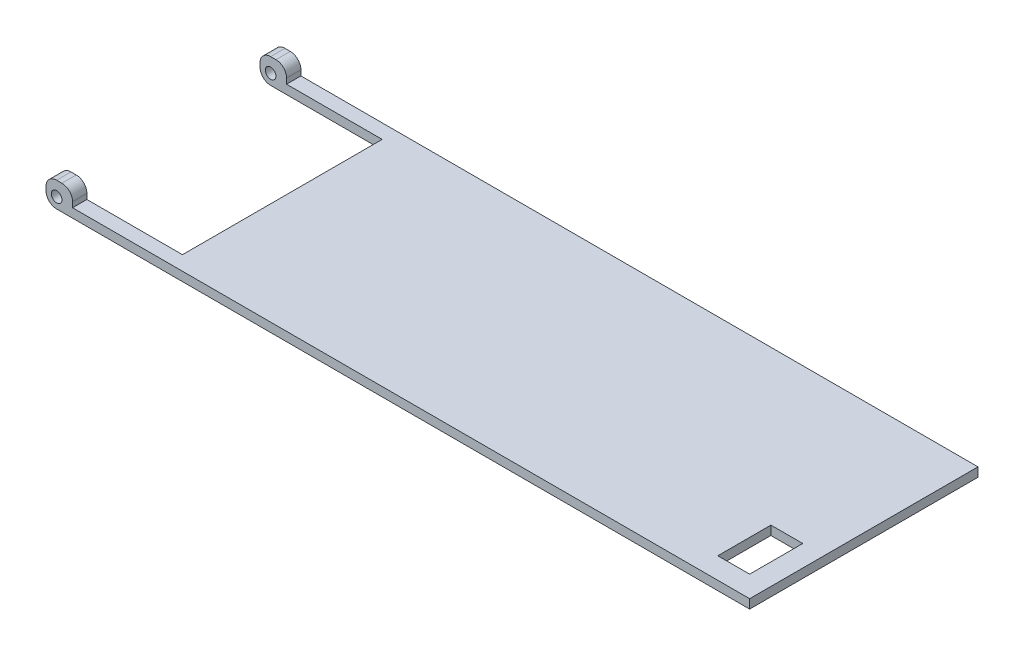
ISO-10303-21;
HEADER;
FILE_DESCRIPTION(('STEP AP214'),'2;1');
FILE_NAME('part.step','',(''),(''),'','','');
FILE_SCHEMA(('AUTOMOTIVE_DESIGN { 1 0 10303 214 1 1 1 1 }'));
ENDSEC;
DATA;
#1=APPLICATION_CONTEXT('core data for automotive mechanical design processes');
#2=APPLICATION_PROTOCOL_DEFINITION('international standard','automotive_design',2000,#1);
#3=PRODUCT_CONTEXT('',#1,'mechanical');
#4=PRODUCT('Part','Part','',(#3));
#5=PRODUCT_RELATED_PRODUCT_CATEGORY('part','',(#4));
#6=PRODUCT_DEFINITION_FORMATION('','',#4);
#7=PRODUCT_DEFINITION_CONTEXT('part definition',#1,'design');
#8=PRODUCT_DEFINITION('design','',#6,#7);
#9=PRODUCT_DEFINITION_SHAPE('','',#8);
#10=(LENGTH_UNIT() NAMED_UNIT(*) SI_UNIT(.MILLI.,.METRE.));
#11=(NAMED_UNIT(*) PLANE_ANGLE_UNIT() SI_UNIT($,.RADIAN.));
#12=(NAMED_UNIT(*) SI_UNIT($,.STERADIAN.) SOLID_ANGLE_UNIT());
#13=UNCERTAINTY_MEASURE_WITH_UNIT(LENGTH_MEASURE(1.E-05),#10,'distance_accuracy_value','');
#14=(GEOMETRIC_REPRESENTATION_CONTEXT(3) GLOBAL_UNCERTAINTY_ASSIGNED_CONTEXT((#13)) GLOBAL_UNIT_ASSIGNED_CONTEXT((#10,
#11,#12)) REPRESENTATION_CONTEXT('',''));
#15=CARTESIAN_POINT('',(0.,0.,0.));
#16=DIRECTION('',(0.,0.,1.));
#17=DIRECTION('',(1.,0.,0.));
#18=AXIS2_PLACEMENT_3D('',#15,#16,#17);
#19=CARTESIAN_POINT('',(0.,1.7,0.));
#20=DIRECTION('',(0.,-1.,0.));
#21=DIRECTION('',(0.,0.,-1.));
#22=AXIS2_PLACEMENT_3D('',#19,#20,#21);
#23=PLANE('',#22);
#24=DIRECTION('',(-1.,0.,0.));
#25=VECTOR('',#24,1.);
#26=CARTESIAN_POINT('',(56.25,1.7,7.5));
#27=LINE('',#26,#25);
#28=CARTESIAN_POINT('',(62.25,1.7,7.5));
#29=VERTEX_POINT('',#28);
#30=CARTESIAN_POINT('',(56.25,1.7,7.5));
#31=VERTEX_POINT('',#30);
#32=EDGE_CURVE('E228',#29,#31,#27,.T.);
#33=ORIENTED_EDGE('',*,*,#32,.F.);
#34=DIRECTION('',(0.,0.,-1.));
#35=VECTOR('',#34,1.);
#36=CARTESIAN_POINT('',(62.25,1.7,17.5));
#37=LINE('',#36,#35);
#38=CARTESIAN_POINT('',(62.25,1.7,17.5));
#39=VERTEX_POINT('',#38);
#40=EDGE_CURVE('E61',#39,#29,#37,.T.);
#41=ORIENTED_EDGE('',*,*,#40,.F.);
#42=DIRECTION('',(1.,0.,0.));
#43=VECTOR('',#42,1.);
#44=CARTESIAN_POINT('',(56.25,1.7,17.5));
#45=LINE('',#44,#43);
#46=CARTESIAN_POINT('',(56.25,1.7,17.5));
#47=VERTEX_POINT('',#46);
#48=EDGE_CURVE('E215',#47,#39,#45,.T.);
#49=ORIENTED_EDGE('',*,*,#48,.F.);
#50=DIRECTION('',(0.,0.,1.));
#51=VECTOR('',#50,1.);
#52=CARTESIAN_POINT('',(56.25,1.7,17.5));
#53=LINE('',#52,#51);
#54=EDGE_CURVE('E219',#31,#47,#53,.T.);
#55=ORIENTED_EDGE('',*,*,#54,.F.);
#56=EDGE_LOOP('',(#33,#41,#49,#55));
#57=FACE_BOUND('',#56,.T.);
#58=DIRECTION('',(-1.,0.,0.));
#59=VECTOR('',#58,1.);
#60=CARTESIAN_POINT('',(-66.25,1.7,-21.5));
#61=LINE('',#60,#59);
#62=CARTESIAN_POINT('',(66.25,1.7,-21.5));
#63=VERTEX_POINT('',#62);
#64=CARTESIAN_POINT('',(-61.25,1.7,-21.5));
#65=VERTEX_POINT('',#64);
#66=EDGE_CURVE('E336',#63,#65,#61,.T.);
#67=ORIENTED_EDGE('',*,*,#66,.T.);
#68=DIRECTION('',(0.,0.,1.));
#69=VECTOR('',#68,1.);
#70=CARTESIAN_POINT('',(-61.25,1.7,-18.8));
#71=LINE('',#70,#69);
#72=CARTESIAN_POINT('',(-61.25,1.7,-18.8));
#73=VERTEX_POINT('',#72);
#74=EDGE_CURVE('E247',#65,#73,#71,.T.);
#75=ORIENTED_EDGE('',*,*,#74,.T.);
#76=DIRECTION('',(-1.,0.,0.));
#77=VECTOR('',#76,1.);
#78=CARTESIAN_POINT('',(-66.25,1.7,-18.8));
#79=LINE('',#78,#77);
#80=CARTESIAN_POINT('',(-43.25,1.7,-18.8));
#81=VERTEX_POINT('',#80);
#82=EDGE_CURVE('E299',#81,#73,#79,.T.);
#83=ORIENTED_EDGE('',*,*,#82,.F.);
#84=DIRECTION('',(0.,0.,-1.));
#85=VECTOR('',#84,1.);
#86=CARTESIAN_POINT('',(-43.25,1.7,18.8));
#87=LINE('',#86,#85);
#88=CARTESIAN_POINT('',(-43.25,1.7,18.8));
#89=VERTEX_POINT('',#88);
#90=EDGE_CURVE('E310',#89,#81,#87,.T.);
#91=ORIENTED_EDGE('',*,*,#90,.F.);
#92=DIRECTION('',(1.,0.,0.));
#93=VECTOR('',#92,1.);
#94=CARTESIAN_POINT('',(-66.25,1.7,18.8));
#95=LINE('',#94,#93);
#96=CARTESIAN_POINT('',(-61.25,1.7,18.8));
#97=VERTEX_POINT('',#96);
#98=EDGE_CURVE('E294',#97,#89,#95,.T.);
#99=ORIENTED_EDGE('',*,*,#98,.F.);
#100=DIRECTION('',(0.,0.,-1.));
#101=VECTOR('',#100,1.);
#102=CARTESIAN_POINT('',(-61.25,1.7,18.8));
#103=LINE('',#102,#101);
#104=CARTESIAN_POINT('',(-61.25,1.7,21.5));
#105=VERTEX_POINT('',#104);
#106=EDGE_CURVE('E273',#105,#97,#103,.T.);
#107=ORIENTED_EDGE('',*,*,#106,.F.);
#108=DIRECTION('',(1.,0.,0.));
#109=VECTOR('',#108,1.);
#110=CARTESIAN_POINT('',(-66.25,1.7,21.5));
#111=LINE('',#110,#109);
#112=CARTESIAN_POINT('',(66.25,1.7,21.5));
#113=VERTEX_POINT('',#112);
#114=EDGE_CURVE('E341',#105,#113,#111,.T.);
#115=ORIENTED_EDGE('',*,*,#114,.T.);
#116=DIRECTION('',(0.,0.,-1.));
#117=VECTOR('',#116,1.);
#118=CARTESIAN_POINT('',(66.25,1.7,21.5));
#119=LINE('',#118,#117);
#120=EDGE_CURVE('E332',#113,#63,#119,.T.);
#121=ORIENTED_EDGE('',*,*,#120,.T.);
#122=EDGE_LOOP('',(#67,#75,#83,#91,#99,#107,#115,#121));
#123=FACE_BOUND('',#122,.T.);
#124=ADVANCED_FACE('F45',(#57,#123),#23,.F.);
#125=CARTESIAN_POINT('',(-66.25,1.7,21.5));
#126=DIRECTION('',(1.,0.,0.));
#127=DIRECTION('',(0.,0.,-1.));
#128=AXIS2_PLACEMENT_3D('',#125,#126,#127);
#129=PLANE('',#128);
#130=DIRECTION('',(0.,-1.,0.));
#131=VECTOR('',#130,1.);
#132=CARTESIAN_POINT('',(-66.25,1.7,-21.5));
#133=LINE('',#132,#131);
#134=CARTESIAN_POINT('',(-66.25,2.7,-21.5));
#135=VERTEX_POINT('',#134);
#136=CARTESIAN_POINT('',(-66.25,2.,-21.5));
#137=VERTEX_POINT('',#136);
#138=EDGE_CURVE('E361',#135,#137,#133,.T.);
#139=ORIENTED_EDGE('',*,*,#138,.T.);
#140=DIRECTION('',(0.,0.,1.));
#141=VECTOR('',#140,1.);
#142=CARTESIAN_POINT('',(-66.25,2.,-18.8));
#143=LINE('',#142,#141);
#144=CARTESIAN_POINT('',(-66.25,2.,-18.8));
#145=VERTEX_POINT('',#144);
#146=EDGE_CURVE('E412',#137,#145,#143,.T.);
#147=ORIENTED_EDGE('',*,*,#146,.T.);
#148=DIRECTION('',(0.,1.,0.));
#149=VECTOR('',#148,1.);
#150=CARTESIAN_POINT('',(-66.25,0.,-18.8));
#151=LINE('',#150,#149);
#152=CARTESIAN_POINT('',(-66.25,2.7,-18.8));
#153=VERTEX_POINT('',#152);
#154=EDGE_CURVE('E317',#145,#153,#151,.T.);
#155=ORIENTED_EDGE('',*,*,#154,.T.);
#156=DIRECTION('',(0.,0.,-1.));
#157=VECTOR('',#156,1.);
#158=CARTESIAN_POINT('',(-66.25,2.7,-21.5));
#159=LINE('',#158,#157);
#160=EDGE_CURVE('E408',#153,#135,#159,.T.);
#161=ORIENTED_EDGE('',*,*,#160,.T.);
#162=EDGE_LOOP('',(#139,#147,#155,#161));
#163=FACE_BOUND('',#162,.T.);
#164=ADVANCED_FACE('F456',(#163),#129,.F.);
#165=CARTESIAN_POINT('',(66.25,1.7,21.5));
#166=DIRECTION('',(-1.,0.,0.));
#167=DIRECTION('',(0.,0.,1.));
#168=AXIS2_PLACEMENT_3D('',#165,#166,#167);
#169=PLANE('',#168);
#170=DIRECTION('',(0.,0.,-1.));
#171=VECTOR('',#170,1.);
#172=CARTESIAN_POINT('',(66.25,0.,21.5));
#173=LINE('',#172,#171);
#174=CARTESIAN_POINT('',(66.25,0.,21.5));
#175=VERTEX_POINT('',#174);
#176=CARTESIAN_POINT('',(66.25,0.,-21.5));
#177=VERTEX_POINT('',#176);
#178=EDGE_CURVE('E321',#175,#177,#173,.T.);
#179=ORIENTED_EDGE('',*,*,#178,.T.);
#180=DIRECTION('',(0.,-1.,0.));
#181=VECTOR('',#180,1.);
#182=CARTESIAN_POINT('',(66.25,1.7,-21.5));
#183=LINE('',#182,#181);
#184=EDGE_CURVE('E365',#63,#177,#183,.T.);
#185=ORIENTED_EDGE('',*,*,#184,.F.);
#186=ORIENTED_EDGE('',*,*,#120,.F.);
#187=DIRECTION('',(0.,-1.,0.));
#188=VECTOR('',#187,1.);
#189=CARTESIAN_POINT('',(66.25,1.7,21.5));
#190=LINE('',#189,#188);
#191=EDGE_CURVE('E344',#113,#175,#190,.T.);
#192=ORIENTED_EDGE('',*,*,#191,.T.);
#193=EDGE_LOOP('',(#179,#185,#186,#192));
#194=FACE_BOUND('',#193,.T.);
#195=ADVANCED_FACE('F512',(#194),#169,.F.);
#196=CARTESIAN_POINT('',(-66.25,1.7,-21.5));
#197=DIRECTION('',(0.,0.,1.));
#198=DIRECTION('',(1.,0.,0.));
#199=AXIS2_PLACEMENT_3D('',#196,#197,#198);
#200=PLANE('',#199);
#201=CARTESIAN_POINT('',(-64.25,2.,-21.5));
#202=DIRECTION('',(0.,0.,1.));
#203=DIRECTION('',(1.,0.,0.));
#204=AXIS2_PLACEMENT_3D('',#201,#202,#203);
#205=CIRCLE('',#204,0.999999999999998);
#206=CARTESIAN_POINT('',(-65.25,2.,-21.5));
#207=VERTEX_POINT('',#206);
#208=EDGE_CURVE('E237',#207,#207,#205,.T.);
#209=ORIENTED_EDGE('',*,*,#208,.T.);
#210=EDGE_LOOP('',(#209));
#211=FACE_BOUND('',#210,.T.);
#212=DIRECTION('',(-1.,0.,0.));
#213=VECTOR('',#212,1.);
#214=CARTESIAN_POINT('',(-66.25,0.,-21.5));
#215=LINE('',#214,#213);
#216=CARTESIAN_POINT('',(-64.25,0.,-21.5));
#217=VERTEX_POINT('',#216);
#218=EDGE_CURVE('E348',#177,#217,#215,.T.);
#219=ORIENTED_EDGE('',*,*,#218,.T.);
#220=CARTESIAN_POINT('',(-64.25,2.,-21.5));
#221=DIRECTION('',(0.,0.,1.));
#222=DIRECTION('',(1.,0.,0.));
#223=AXIS2_PLACEMENT_3D('',#220,#221,#222);
#224=CIRCLE('',#223,2.);
#225=EDGE_CURVE('E434',#217,#137,#224,.F.);
#226=ORIENTED_EDGE('',*,*,#225,.T.);
#227=ORIENTED_EDGE('',*,*,#138,.F.);
#228=CARTESIAN_POINT('',(-64.25,2.7,-21.5));
#229=DIRECTION('',(0.,0.,1.));
#230=DIRECTION('',(1.,0.,0.));
#231=AXIS2_PLACEMENT_3D('',#228,#229,#230);
#232=CIRCLE('',#231,2.);
#233=CARTESIAN_POINT('',(-64.25,4.7,-21.5));
#234=VERTEX_POINT('',#233);
#235=EDGE_CURVE('E428',#135,#234,#232,.F.);
#236=ORIENTED_EDGE('',*,*,#235,.T.);
#237=DIRECTION('',(1.,0.,0.));
#238=VECTOR('',#237,1.);
#239=CARTESIAN_POINT('',(-66.25,4.7,-21.5));
#240=LINE('',#239,#238);
#241=CARTESIAN_POINT('',(-63.25,4.7,-21.5));
#242=VERTEX_POINT('',#241);
#243=EDGE_CURVE('E255',#234,#242,#240,.T.);
#244=ORIENTED_EDGE('',*,*,#243,.T.);
#245=CARTESIAN_POINT('',(-63.25,2.7,-21.5));
#246=DIRECTION('',(0.,0.,1.));
#247=DIRECTION('',(1.,0.,0.));
#248=AXIS2_PLACEMENT_3D('',#245,#246,#247);
#249=CIRCLE('',#248,2.);
#250=CARTESIAN_POINT('',(-61.25,2.7,-21.5));
#251=VERTEX_POINT('',#250);
#252=EDGE_CURVE('E431',#242,#251,#249,.F.);
#253=ORIENTED_EDGE('',*,*,#252,.T.);
#254=DIRECTION('',(0.,-1.,0.));
#255=VECTOR('',#254,1.);
#256=CARTESIAN_POINT('',(-61.25,4.7,-21.5));
#257=LINE('',#256,#255);
#258=EDGE_CURVE('E259',#251,#65,#257,.T.);
#259=ORIENTED_EDGE('',*,*,#258,.T.);
#260=ORIENTED_EDGE('',*,*,#66,.F.);
#261=ORIENTED_EDGE('',*,*,#184,.T.);
#262=EDGE_LOOP('',(#219,#226,#227,#236,#244,#253,#259,#260,#261));
#263=FACE_BOUND('',#262,.T.);
#264=ADVANCED_FACE('F459',(#211,#263),#200,.F.);
#265=DIRECTION('',(0.,1.,0.));
#266=VECTOR('',#265,1.);
#267=CARTESIAN_POINT('',(-66.25,0.,18.8));
#268=LINE('',#267,#266);
#269=CARTESIAN_POINT('',(-66.25,2.,18.8));
#270=VERTEX_POINT('',#269);
#271=CARTESIAN_POINT('',(-66.25,2.7,18.8));
#272=VERTEX_POINT('',#271);
#273=EDGE_CURVE('E307',#270,#272,#268,.T.);
#274=ORIENTED_EDGE('',*,*,#273,.F.);
#275=DIRECTION('',(0.,0.,1.));
#276=VECTOR('',#275,1.);
#277=CARTESIAN_POINT('',(-66.25,2.,21.5));
#278=LINE('',#277,#276);
#279=CARTESIAN_POINT('',(-66.25,2.,21.5));
#280=VERTEX_POINT('',#279);
#281=EDGE_CURVE('E372',#270,#280,#278,.T.);
#282=ORIENTED_EDGE('',*,*,#281,.T.);
#283=DIRECTION('',(0.,-1.,0.));
#284=VECTOR('',#283,1.);
#285=CARTESIAN_POINT('',(-66.25,1.7,21.5));
#286=LINE('',#285,#284);
#287=CARTESIAN_POINT('',(-66.25,2.7,21.5));
#288=VERTEX_POINT('',#287);
#289=EDGE_CURVE('E357',#288,#280,#286,.T.);
#290=ORIENTED_EDGE('',*,*,#289,.F.);
#291=DIRECTION('',(0.,0.,1.));
#292=VECTOR('',#291,1.);
#293=CARTESIAN_POINT('',(-66.25,2.7,18.8));
#294=LINE('',#293,#292);
#295=EDGE_CURVE('E369',#288,#272,#294,.F.);
#296=ORIENTED_EDGE('',*,*,#295,.T.);
#297=EDGE_LOOP('',(#274,#282,#290,#296));
#298=FACE_BOUND('',#297,.T.);
#299=ADVANCED_FACE('F503',(#298),#129,.F.);
#300=CARTESIAN_POINT('',(-66.25,1.7,21.5));
#301=DIRECTION('',(0.,0.,-1.));
#302=DIRECTION('',(-1.,0.,0.));
#303=AXIS2_PLACEMENT_3D('',#300,#301,#302);
#304=PLANE('',#303);
#305=CARTESIAN_POINT('',(-64.25,2.,21.5));
#306=DIRECTION('',(0.,0.,1.));
#307=DIRECTION('',(1.,0.,0.));
#308=AXIS2_PLACEMENT_3D('',#305,#306,#307);
#309=CIRCLE('',#308,0.999999999999998);
#310=CARTESIAN_POINT('',(-63.25,2.,21.5));
#311=VERTEX_POINT('',#310);
#312=EDGE_CURVE('E268',#311,#311,#309,.T.);
#313=ORIENTED_EDGE('',*,*,#312,.F.);
#314=EDGE_LOOP('',(#313));
#315=FACE_BOUND('',#314,.T.);
#316=ORIENTED_EDGE('',*,*,#289,.T.);
#317=CARTESIAN_POINT('',(-64.25,2.,21.5));
#318=DIRECTION('',(0.,0.,-1.));
#319=DIRECTION('',(-1.,0.,0.));
#320=AXIS2_PLACEMENT_3D('',#317,#318,#319);
#321=CIRCLE('',#320,2.);
#322=CARTESIAN_POINT('',(-64.25,0.,21.5));
#323=VERTEX_POINT('',#322);
#324=EDGE_CURVE('E382',#280,#323,#321,.F.);
#325=ORIENTED_EDGE('',*,*,#324,.T.);
#326=DIRECTION('',(1.,0.,0.));
#327=VECTOR('',#326,1.);
#328=CARTESIAN_POINT('',(-66.25,0.,21.5));
#329=LINE('',#328,#327);
#330=EDGE_CURVE('E337',#323,#175,#329,.T.);
#331=ORIENTED_EDGE('',*,*,#330,.T.);
#332=ORIENTED_EDGE('',*,*,#191,.F.);
#333=ORIENTED_EDGE('',*,*,#114,.F.);
#334=DIRECTION('',(0.,-1.,0.));
#335=VECTOR('',#334,1.);
#336=CARTESIAN_POINT('',(-61.25,4.7,21.5));
#337=LINE('',#336,#335);
#338=CARTESIAN_POINT('',(-61.25,2.7,21.5));
#339=VERTEX_POINT('',#338);
#340=EDGE_CURVE('E291',#339,#105,#337,.T.);
#341=ORIENTED_EDGE('',*,*,#340,.F.);
#342=CARTESIAN_POINT('',(-63.25,2.7,21.5));
#343=DIRECTION('',(0.,0.,-1.));
#344=DIRECTION('',(-1.,0.,0.));
#345=AXIS2_PLACEMENT_3D('',#342,#343,#344);
#346=CIRCLE('',#345,2.);
#347=CARTESIAN_POINT('',(-63.25,4.7,21.5));
#348=VERTEX_POINT('',#347);
#349=EDGE_CURVE('E379',#339,#348,#346,.F.);
#350=ORIENTED_EDGE('',*,*,#349,.T.);
#351=DIRECTION('',(1.,0.,0.));
#352=VECTOR('',#351,1.);
#353=CARTESIAN_POINT('',(-66.25,4.7,21.5));
#354=LINE('',#353,#352);
#355=CARTESIAN_POINT('',(-64.25,4.7,21.5));
#356=VERTEX_POINT('',#355);
#357=EDGE_CURVE('E277',#356,#348,#354,.T.);
#358=ORIENTED_EDGE('',*,*,#357,.F.);
#359=CARTESIAN_POINT('',(-64.25,2.7,21.5));
#360=DIRECTION('',(0.,0.,-1.));
#361=DIRECTION('',(-1.,0.,0.));
#362=AXIS2_PLACEMENT_3D('',#359,#360,#361);
#363=CIRCLE('',#362,2.);
#364=EDGE_CURVE('E376',#356,#288,#363,.F.);
#365=ORIENTED_EDGE('',*,*,#364,.T.);
#366=EDGE_LOOP('',(#316,#325,#331,#332,#333,#341,#350,#358,#365));
#367=FACE_BOUND('',#366,.T.);
#368=ADVANCED_FACE('F486',(#315,#367),#304,.F.);
#369=CARTESIAN_POINT('',(0.,0.,0.));
#370=DIRECTION('',(0.,-1.,0.));
#371=DIRECTION('',(0.,0.,-1.));
#372=AXIS2_PLACEMENT_3D('',#369,#370,#371);
#373=PLANE('',#372);
#374=DIRECTION('',(0.,0.,-1.));
#375=VECTOR('',#374,1.);
#376=CARTESIAN_POINT('',(62.25,0.,17.5));
#377=LINE('',#376,#375);
#378=CARTESIAN_POINT('',(62.25,0.,17.5));
#379=VERTEX_POINT('',#378);
#380=CARTESIAN_POINT('',(62.25,0.,7.5));
#381=VERTEX_POINT('',#380);
#382=EDGE_CURVE('E196',#379,#381,#377,.T.);
#383=ORIENTED_EDGE('',*,*,#382,.T.);
#384=DIRECTION('',(-1.,0.,0.));
#385=VECTOR('',#384,1.);
#386=CARTESIAN_POINT('',(56.25,0.,7.5));
#387=LINE('',#386,#385);
#388=CARTESIAN_POINT('',(56.25,0.,7.5));
#389=VERTEX_POINT('',#388);
#390=EDGE_CURVE('E206',#381,#389,#387,.T.);
#391=ORIENTED_EDGE('',*,*,#390,.T.);
#392=DIRECTION('',(0.,0.,1.));
#393=VECTOR('',#392,1.);
#394=CARTESIAN_POINT('',(56.25,0.,17.5));
#395=LINE('',#394,#393);
#396=CARTESIAN_POINT('',(56.25,0.,17.5));
#397=VERTEX_POINT('',#396);
#398=EDGE_CURVE('E69',#389,#397,#395,.T.);
#399=ORIENTED_EDGE('',*,*,#398,.T.);
#400=DIRECTION('',(1.,0.,0.));
#401=VECTOR('',#400,1.);
#402=CARTESIAN_POINT('',(56.25,0.,17.5));
#403=LINE('',#402,#401);
#404=EDGE_CURVE('E203',#397,#379,#403,.T.);
#405=ORIENTED_EDGE('',*,*,#404,.T.);
#406=EDGE_LOOP('',(#383,#391,#399,#405));
#407=FACE_BOUND('',#406,.T.);
#408=DIRECTION('',(-1.,0.,0.));
#409=VECTOR('',#408,1.);
#410=CARTESIAN_POINT('',(-66.25,0.,-18.8));
#411=LINE('',#410,#409);
#412=CARTESIAN_POINT('',(-43.25,0.,-18.8));
#413=VERTEX_POINT('',#412);
#414=CARTESIAN_POINT('',(-64.25,0.,-18.8));
#415=VERTEX_POINT('',#414);
#416=EDGE_CURVE('E303',#413,#415,#411,.T.);
#417=ORIENTED_EDGE('',*,*,#416,.T.);
#418=DIRECTION('',(0.,0.,1.));
#419=VECTOR('',#418,1.);
#420=CARTESIAN_POINT('',(-64.25,0.,-21.5));
#421=LINE('',#420,#419);
#422=EDGE_CURVE('E425',#415,#217,#421,.F.);
#423=ORIENTED_EDGE('',*,*,#422,.T.);
#424=ORIENTED_EDGE('',*,*,#218,.F.);
#425=ORIENTED_EDGE('',*,*,#178,.F.);
#426=ORIENTED_EDGE('',*,*,#330,.F.);
#427=DIRECTION('',(0.,0.,1.));
#428=VECTOR('',#427,1.);
#429=CARTESIAN_POINT('',(-64.25,0.,18.8));
#430=LINE('',#429,#428);
#431=CARTESIAN_POINT('',(-64.25,0.,18.8));
#432=VERTEX_POINT('',#431);
#433=EDGE_CURVE('E385',#323,#432,#430,.F.);
#434=ORIENTED_EDGE('',*,*,#433,.T.);
#435=DIRECTION('',(1.,0.,0.));
#436=VECTOR('',#435,1.);
#437=CARTESIAN_POINT('',(-66.25,0.,18.8));
#438=LINE('',#437,#436);
#439=CARTESIAN_POINT('',(-43.25,0.,18.8));
#440=VERTEX_POINT('',#439);
#441=EDGE_CURVE('E295',#432,#440,#438,.T.);
#442=ORIENTED_EDGE('',*,*,#441,.T.);
#443=DIRECTION('',(0.,0.,-1.));
#444=VECTOR('',#443,1.);
#445=CARTESIAN_POINT('',(-43.25,0.,18.8));
#446=LINE('',#445,#444);
#447=EDGE_CURVE('E298',#440,#413,#446,.T.);
#448=ORIENTED_EDGE('',*,*,#447,.T.);
#449=EDGE_LOOP('',(#417,#423,#424,#425,#426,#434,#442,#448));
#450=FACE_BOUND('',#449,.T.);
#451=ADVANCED_FACE('F211',(#407,#450),#373,.T.);
#452=CARTESIAN_POINT('',(-66.25,0.,-18.8));
#453=DIRECTION('',(0.,0.,-1.));
#454=DIRECTION('',(-1.,0.,0.));
#455=AXIS2_PLACEMENT_3D('',#452,#453,#454);
#456=PLANE('',#455);
#457=CARTESIAN_POINT('',(-64.25,2.,-18.8));
#458=DIRECTION('',(0.,0.,1.));
#459=DIRECTION('',(1.,0.,0.));
#460=AXIS2_PLACEMENT_3D('',#457,#458,#459);
#461=CIRCLE('',#460,0.999999999999998);
#462=CARTESIAN_POINT('',(-65.25,2.,-18.8));
#463=VERTEX_POINT('',#462);
#464=EDGE_CURVE('E243',#463,#463,#461,.T.);
#465=ORIENTED_EDGE('',*,*,#464,.F.);
#466=EDGE_LOOP('',(#465));
#467=FACE_BOUND('',#466,.T.);
#468=ORIENTED_EDGE('',*,*,#154,.F.);
#469=CARTESIAN_POINT('',(-64.25,2.,-18.8));
#470=DIRECTION('',(0.,0.,-1.));
#471=DIRECTION('',(-1.,0.,0.));
#472=AXIS2_PLACEMENT_3D('',#469,#470,#471);
#473=CIRCLE('',#472,2.);
#474=EDGE_CURVE('E422',#145,#415,#473,.F.);
#475=ORIENTED_EDGE('',*,*,#474,.T.);
#476=ORIENTED_EDGE('',*,*,#416,.F.);
#477=DIRECTION('',(0.,1.,0.));
#478=VECTOR('',#477,1.);
#479=CARTESIAN_POINT('',(-43.25,0.,-18.8));
#480=LINE('',#479,#478);
#481=EDGE_CURVE('E322',#413,#81,#480,.T.);
#482=ORIENTED_EDGE('',*,*,#481,.T.);
#483=ORIENTED_EDGE('',*,*,#82,.T.);
#484=DIRECTION('',(0.,-1.,0.));
#485=VECTOR('',#484,1.);
#486=CARTESIAN_POINT('',(-61.25,4.7,-18.8));
#487=LINE('',#486,#485);
#488=CARTESIAN_POINT('',(-61.25,2.7,-18.8));
#489=VERTEX_POINT('',#488);
#490=EDGE_CURVE('E265',#489,#73,#487,.T.);
#491=ORIENTED_EDGE('',*,*,#490,.F.);
#492=CARTESIAN_POINT('',(-63.25,2.7,-18.8));
#493=DIRECTION('',(0.,0.,-1.));
#494=DIRECTION('',(-1.,0.,0.));
#495=AXIS2_PLACEMENT_3D('',#492,#493,#494);
#496=CIRCLE('',#495,2.);
#497=CARTESIAN_POINT('',(-63.25,4.7,-18.8));
#498=VERTEX_POINT('',#497);
#499=EDGE_CURVE('E419',#489,#498,#496,.F.);
#500=ORIENTED_EDGE('',*,*,#499,.T.);
#501=DIRECTION('',(-1.,0.,0.));
#502=VECTOR('',#501,1.);
#503=CARTESIAN_POINT('',(-66.25,4.7,-18.8));
#504=LINE('',#503,#502);
#505=CARTESIAN_POINT('',(-64.25,4.7,-18.8));
#506=VERTEX_POINT('',#505);
#507=EDGE_CURVE('E251',#498,#506,#504,.T.);
#508=ORIENTED_EDGE('',*,*,#507,.T.);
#509=CARTESIAN_POINT('',(-64.25,2.7,-18.8));
#510=DIRECTION('',(0.,0.,-1.));
#511=DIRECTION('',(-1.,0.,0.));
#512=AXIS2_PLACEMENT_3D('',#509,#510,#511);
#513=CIRCLE('',#512,2.);
#514=EDGE_CURVE('E416',#506,#153,#513,.F.);
#515=ORIENTED_EDGE('',*,*,#514,.T.);
#516=EDGE_LOOP('',(#468,#475,#476,#482,#483,#491,#500,#508,#515));
#517=FACE_BOUND('',#516,.T.);
#518=ADVANCED_FACE('F451',(#467,#517),#456,.F.);
#519=CARTESIAN_POINT('',(-43.25,0.,18.8));
#520=DIRECTION('',(1.,0.,0.));
#521=DIRECTION('',(0.,0.,-1.));
#522=AXIS2_PLACEMENT_3D('',#519,#520,#521);
#523=PLANE('',#522);
#524=ORIENTED_EDGE('',*,*,#90,.T.);
#525=ORIENTED_EDGE('',*,*,#481,.F.);
#526=ORIENTED_EDGE('',*,*,#447,.F.);
#527=DIRECTION('',(0.,1.,0.));
#528=VECTOR('',#527,1.);
#529=CARTESIAN_POINT('',(-43.25,0.,18.8));
#530=LINE('',#529,#528);
#531=EDGE_CURVE('E325',#440,#89,#530,.T.);
#532=ORIENTED_EDGE('',*,*,#531,.T.);
#533=EDGE_LOOP('',(#524,#525,#526,#532));
#534=FACE_BOUND('',#533,.T.);
#535=ADVANCED_FACE('F469',(#534),#523,.F.);
#536=CARTESIAN_POINT('',(-66.25,0.,18.8));
#537=DIRECTION('',(0.,0.,1.));
#538=DIRECTION('',(1.,0.,0.));
#539=AXIS2_PLACEMENT_3D('',#536,#537,#538);
#540=PLANE('',#539);
#541=CARTESIAN_POINT('',(-64.25,2.,18.8));
#542=DIRECTION('',(0.,0.,1.));
#543=DIRECTION('',(1.,0.,0.));
#544=AXIS2_PLACEMENT_3D('',#541,#542,#543);
#545=CIRCLE('',#544,0.999999999999998);
#546=CARTESIAN_POINT('',(-63.25,2.,18.8));
#547=VERTEX_POINT('',#546);
#548=EDGE_CURVE('E269',#547,#547,#545,.T.);
#549=ORIENTED_EDGE('',*,*,#548,.T.);
#550=EDGE_LOOP('',(#549));
#551=FACE_BOUND('',#550,.T.);
#552=ORIENTED_EDGE('',*,*,#441,.F.);
#553=CARTESIAN_POINT('',(-64.25,2.,18.8));
#554=DIRECTION('',(0.,0.,1.));
#555=DIRECTION('',(1.,0.,0.));
#556=AXIS2_PLACEMENT_3D('',#553,#554,#555);
#557=CIRCLE('',#556,2.);
#558=EDGE_CURVE('E394',#432,#270,#557,.F.);
#559=ORIENTED_EDGE('',*,*,#558,.T.);
#560=ORIENTED_EDGE('',*,*,#273,.T.);
#561=CARTESIAN_POINT('',(-64.25,2.7,18.8));
#562=DIRECTION('',(0.,0.,1.));
#563=DIRECTION('',(1.,0.,0.));
#564=AXIS2_PLACEMENT_3D('',#561,#562,#563);
#565=CIRCLE('',#564,2.);
#566=CARTESIAN_POINT('',(-64.25,4.7,18.8));
#567=VERTEX_POINT('',#566);
#568=EDGE_CURVE('E388',#272,#567,#565,.F.);
#569=ORIENTED_EDGE('',*,*,#568,.T.);
#570=DIRECTION('',(-1.,0.,0.));
#571=VECTOR('',#570,1.);
#572=CARTESIAN_POINT('',(-66.25,4.7,18.8));
#573=LINE('',#572,#571);
#574=CARTESIAN_POINT('',(-63.25,4.7,18.8));
#575=VERTEX_POINT('',#574);
#576=EDGE_CURVE('E281',#575,#567,#573,.T.);
#577=ORIENTED_EDGE('',*,*,#576,.F.);
#578=CARTESIAN_POINT('',(-63.25,2.7,18.8));
#579=DIRECTION('',(0.,0.,1.));
#580=DIRECTION('',(1.,0.,0.));
#581=AXIS2_PLACEMENT_3D('',#578,#579,#580);
#582=CIRCLE('',#581,2.);
#583=CARTESIAN_POINT('',(-61.25,2.7,18.8));
#584=VERTEX_POINT('',#583);
#585=EDGE_CURVE('E391',#575,#584,#582,.F.);
#586=ORIENTED_EDGE('',*,*,#585,.T.);
#587=DIRECTION('',(0.,-1.,0.));
#588=VECTOR('',#587,1.);
#589=CARTESIAN_POINT('',(-61.25,4.7,18.8));
#590=LINE('',#589,#588);
#591=EDGE_CURVE('E285',#584,#97,#590,.T.);
#592=ORIENTED_EDGE('',*,*,#591,.T.);
#593=ORIENTED_EDGE('',*,*,#98,.T.);
#594=ORIENTED_EDGE('',*,*,#531,.F.);
#595=EDGE_LOOP('',(#552,#559,#560,#569,#577,#586,#592,#593,#594));
#596=FACE_BOUND('',#595,.T.);
#597=ADVANCED_FACE('F472',(#551,#596),#540,.F.);
#598=CARTESIAN_POINT('',(-61.25,4.7,18.8));
#599=DIRECTION('',(-1.,0.,0.));
#600=DIRECTION('',(0.,0.,1.));
#601=AXIS2_PLACEMENT_3D('',#598,#599,#600);
#602=PLANE('',#601);
#603=ORIENTED_EDGE('',*,*,#591,.F.);
#604=DIRECTION('',(0.,0.,-1.));
#605=VECTOR('',#604,1.);
#606=CARTESIAN_POINT('',(-61.25,2.7,21.5));
#607=LINE('',#606,#605);
#608=EDGE_CURVE('E405',#584,#339,#607,.F.);
#609=ORIENTED_EDGE('',*,*,#608,.T.);
#610=ORIENTED_EDGE('',*,*,#340,.T.);
#611=ORIENTED_EDGE('',*,*,#106,.T.);
#612=EDGE_LOOP('',(#603,#609,#610,#611));
#613=FACE_BOUND('',#612,.T.);
#614=ADVANCED_FACE('F481',(#613),#602,.F.);
#615=CARTESIAN_POINT('',(0.,4.7,0.));
#616=DIRECTION('',(0.,1.,0.));
#617=DIRECTION('',(0.,0.,1.));
#618=AXIS2_PLACEMENT_3D('',#615,#616,#617);
#619=PLANE('',#618);
#620=ORIENTED_EDGE('',*,*,#357,.T.);
#621=DIRECTION('',(0.,0.,-1.));
#622=VECTOR('',#621,1.);
#623=CARTESIAN_POINT('',(-63.25,4.7,18.8));
#624=LINE('',#623,#622);
#625=EDGE_CURVE('E401',#348,#575,#624,.T.);
#626=ORIENTED_EDGE('',*,*,#625,.T.);
#627=ORIENTED_EDGE('',*,*,#576,.T.);
#628=DIRECTION('',(0.,0.,1.));
#629=VECTOR('',#628,1.);
#630=CARTESIAN_POINT('',(-64.25,4.7,21.5));
#631=LINE('',#630,#629);
#632=EDGE_CURVE('E397',#567,#356,#631,.T.);
#633=ORIENTED_EDGE('',*,*,#632,.T.);
#634=EDGE_LOOP('',(#620,#626,#627,#633));
#635=FACE_BOUND('',#634,.T.);
#636=ADVANCED_FACE('F494',(#635),#619,.T.);
#637=CARTESIAN_POINT('',(-64.25,2.,18.8));
#638=DIRECTION('',(0.,0.,1.));
#639=DIRECTION('',(1.,0.,0.));
#640=AXIS2_PLACEMENT_3D('',#637,#638,#639);
#641=CYLINDRICAL_SURFACE('',#640,0.999999999999998);
#642=CARTESIAN_POINT('',(-63.25,2.,18.8));
#643=CARTESIAN_POINT('',(-63.25,2.,18.828125));
#644=CARTESIAN_POINT('',(-63.25,2.,18.85625));
#645=CARTESIAN_POINT('',(-63.25,2.,18.9125));
#646=CARTESIAN_POINT('',(-63.25,2.,18.940625));
#647=CARTESIAN_POINT('',(-63.25,2.,18.996875));
#648=CARTESIAN_POINT('',(-63.25,2.,19.025));
#649=CARTESIAN_POINT('',(-63.25,2.,19.08125));
#650=CARTESIAN_POINT('',(-63.25,2.,19.109375));
#651=CARTESIAN_POINT('',(-63.25,2.,19.165625));
#652=CARTESIAN_POINT('',(-63.25,2.,19.19375));
#653=CARTESIAN_POINT('',(-63.25,2.,19.25));
#654=CARTESIAN_POINT('',(-63.25,2.,19.278125));
#655=CARTESIAN_POINT('',(-63.25,2.,19.334375));
#656=CARTESIAN_POINT('',(-63.25,2.,19.3625));
#657=CARTESIAN_POINT('',(-63.25,2.,19.41875));
#658=CARTESIAN_POINT('',(-63.25,2.,19.446875));
#659=CARTESIAN_POINT('',(-63.25,2.,19.503125));
#660=CARTESIAN_POINT('',(-63.25,2.,19.53125));
#661=CARTESIAN_POINT('',(-63.25,2.,19.5875));
#662=CARTESIAN_POINT('',(-63.25,2.,19.615625));
#663=CARTESIAN_POINT('',(-63.25,2.,19.671875));
#664=CARTESIAN_POINT('',(-63.25,2.,19.7));
#665=CARTESIAN_POINT('',(-63.25,2.,19.75625));
#666=CARTESIAN_POINT('',(-63.25,2.,19.784375));
#667=CARTESIAN_POINT('',(-63.25,2.,19.840625));
#668=CARTESIAN_POINT('',(-63.25,2.,19.86875));
#669=CARTESIAN_POINT('',(-63.25,2.,19.925));
#670=CARTESIAN_POINT('',(-63.25,2.,19.953125));
#671=CARTESIAN_POINT('',(-63.25,2.,20.009375));
#672=CARTESIAN_POINT('',(-63.25,2.,20.0375));
#673=CARTESIAN_POINT('',(-63.25,2.,20.09375));
#674=CARTESIAN_POINT('',(-63.25,2.,20.121875));
#675=CARTESIAN_POINT('',(-63.25,2.,20.178125));
#676=CARTESIAN_POINT('',(-63.25,2.,20.20625));
#677=CARTESIAN_POINT('',(-63.25,2.,20.2625));
#678=CARTESIAN_POINT('',(-63.25,2.,20.290625));
#679=CARTESIAN_POINT('',(-63.25,2.,20.346875));
#680=CARTESIAN_POINT('',(-63.25,2.,20.375));
#681=CARTESIAN_POINT('',(-63.25,2.,20.43125));
#682=CARTESIAN_POINT('',(-63.25,2.,20.459375));
#683=CARTESIAN_POINT('',(-63.25,2.,20.515625));
#684=CARTESIAN_POINT('',(-63.25,2.,20.54375));
#685=CARTESIAN_POINT('',(-63.25,2.,20.6));
#686=CARTESIAN_POINT('',(-63.25,2.,20.628125));
#687=CARTESIAN_POINT('',(-63.25,2.,20.684375));
#688=CARTESIAN_POINT('',(-63.25,2.,20.7125));
#689=CARTESIAN_POINT('',(-63.25,2.,20.76875));
#690=CARTESIAN_POINT('',(-63.25,2.,20.796875));
#691=CARTESIAN_POINT('',(-63.25,2.,20.853125));
#692=CARTESIAN_POINT('',(-63.25,2.,20.88125));
#693=CARTESIAN_POINT('',(-63.25,2.,20.9375));
#694=CARTESIAN_POINT('',(-63.25,2.,20.965625));
#695=CARTESIAN_POINT('',(-63.25,2.,21.021875));
#696=CARTESIAN_POINT('',(-63.25,2.,21.05));
#697=CARTESIAN_POINT('',(-63.25,2.,21.10625));
#698=CARTESIAN_POINT('',(-63.25,2.,21.134375));
#699=CARTESIAN_POINT('',(-63.25,2.,21.190625));
#700=CARTESIAN_POINT('',(-63.25,2.,21.21875));
#701=CARTESIAN_POINT('',(-63.25,2.,21.275));
#702=CARTESIAN_POINT('',(-63.25,2.,21.303125));
#703=CARTESIAN_POINT('',(-63.25,2.,21.359375));
#704=CARTESIAN_POINT('',(-63.25,2.,21.3875));
#705=CARTESIAN_POINT('',(-63.25,2.,21.44375));
#706=CARTESIAN_POINT('',(-63.25,2.,21.471875));
#707=CARTESIAN_POINT('',(-63.25,2.,21.5));
#708=B_SPLINE_CURVE_WITH_KNOTS('',3,(#642,#643,#644,#645,#646,#647,#648,#649,#650,#651,#652,
#653,#654,#655,#656,#657,#658,#659,#660,#661,#662,#663,#664,#665,#666,#667,#668,#669,#670,#671,
#672,#673,#674,#675,#676,#677,#678,#679,#680,#681,#682,#683,#684,#685,#686,#687,#688,#689,#690,
#691,#692,#693,#694,#695,#696,#697,#698,#699,#700,#701,#702,#703,#704,#705,#706,#707),
.UNSPECIFIED.,.F.,.F.,(4,2,2,2,2,2,2,2,2,2,2,2,2,2,2,2,2,2,2,2,2,2,2,2,2,2,2,2,2,2,2,2,4),(0.,
0.0843750000000011,0.168750000000002,0.253125000000003,0.337500000000001,0.421875000000002,
0.506250000000003,0.590625000000001,0.675000000000002,0.759375000000003,0.843750000000001,
0.928125000000002,1.0125,1.096875,1.18125,1.265625,1.35,1.434375,1.51875,1.603125,1.6875,
1.771875,1.85625,1.940625,2.025,2.109375,2.19375,2.278125,2.3625,2.446875,2.53125,2.615625,2.7),.UNSPECIFIED.);
#709=EDGE_CURVE('BSEAM552',#547,#311,#708,.T.);
#710=ORIENTED_EDGE('',*,*,#548,.F.);
#711=ORIENTED_EDGE('',*,*,#312,.T.);
#712=ORIENTED_EDGE('',*,*,#709,.T.);
#713=ORIENTED_EDGE('',*,*,#709,.F.);
#714=EDGE_LOOP('',(#710,#712,#711,#713));
#715=FACE_BOUND('',#714,.T.);
#716=ADVANCED_FACE('F552',(#715),#641,.F.);
#717=CARTESIAN_POINT('',(-64.25,2.,21.5));
#718=DIRECTION('',(0.,0.,-1.));
#719=DIRECTION('',(-1.,0.,0.));
#720=AXIS2_PLACEMENT_3D('',#717,#718,#719);
#721=CYLINDRICAL_SURFACE('',#720,2.);
#722=ORIENTED_EDGE('',*,*,#558,.F.);
#723=ORIENTED_EDGE('',*,*,#433,.F.);
#724=ORIENTED_EDGE('',*,*,#324,.F.);
#725=ORIENTED_EDGE('',*,*,#281,.F.);
#726=EDGE_LOOP('',(#722,#723,#724,#725));
#727=FACE_BOUND('',#726,.T.);
#728=ADVANCED_FACE('F506',(#727),#721,.T.);
#729=CARTESIAN_POINT('',(-63.25,2.7,0.));
#730=DIRECTION('',(0.,0.,1.));
#731=DIRECTION('',(1.,0.,0.));
#732=AXIS2_PLACEMENT_3D('',#729,#730,#731);
#733=CYLINDRICAL_SURFACE('',#732,2.);
#734=ORIENTED_EDGE('',*,*,#349,.F.);
#735=ORIENTED_EDGE('',*,*,#608,.F.);
#736=ORIENTED_EDGE('',*,*,#585,.F.);
#737=ORIENTED_EDGE('',*,*,#625,.F.);
#738=EDGE_LOOP('',(#734,#735,#736,#737));
#739=FACE_BOUND('',#738,.T.);
#740=ADVANCED_FACE('F491',(#739),#733,.T.);
#741=CARTESIAN_POINT('',(-64.25,2.7,0.));
#742=DIRECTION('',(0.,0.,-1.));
#743=DIRECTION('',(-1.,0.,0.));
#744=AXIS2_PLACEMENT_3D('',#741,#742,#743);
#745=CYLINDRICAL_SURFACE('',#744,2.);
#746=ORIENTED_EDGE('',*,*,#568,.F.);
#747=ORIENTED_EDGE('',*,*,#295,.F.);
#748=ORIENTED_EDGE('',*,*,#364,.F.);
#749=ORIENTED_EDGE('',*,*,#632,.F.);
#750=EDGE_LOOP('',(#746,#747,#748,#749));
#751=FACE_BOUND('',#750,.T.);
#752=ADVANCED_FACE('F500',(#751),#745,.T.);
#753=CARTESIAN_POINT('',(-61.25,4.7,-18.8));
#754=DIRECTION('',(1.,0.,0.));
#755=DIRECTION('',(0.,0.,-1.));
#756=AXIS2_PLACEMENT_3D('',#753,#754,#755);
#757=PLANE('',#756);
#758=ORIENTED_EDGE('',*,*,#258,.F.);
#759=DIRECTION('',(0.,0.,1.));
#760=VECTOR('',#759,1.);
#761=CARTESIAN_POINT('',(-61.25,2.7,-18.8));
#762=LINE('',#761,#760);
#763=EDGE_CURVE('E437',#251,#489,#762,.T.);
#764=ORIENTED_EDGE('',*,*,#763,.T.);
#765=ORIENTED_EDGE('',*,*,#490,.T.);
#766=ORIENTED_EDGE('',*,*,#74,.F.);
#767=EDGE_LOOP('',(#758,#764,#765,#766));
#768=FACE_BOUND('',#767,.T.);
#769=ADVANCED_FACE('F519',(#768),#757,.T.);
#770=CARTESIAN_POINT('',(0.,4.7,0.));
#771=DIRECTION('',(0.,1.,0.));
#772=DIRECTION('',(0.,0.,-1.));
#773=AXIS2_PLACEMENT_3D('',#770,#771,#772);
#774=PLANE('',#773);
#775=ORIENTED_EDGE('',*,*,#507,.F.);
#776=DIRECTION('',(0.,0.,1.));
#777=VECTOR('',#776,1.);
#778=CARTESIAN_POINT('',(-63.25,4.7,0.));
#779=LINE('',#778,#777);
#780=EDGE_CURVE('E11',#498,#242,#779,.F.);
#781=ORIENTED_EDGE('',*,*,#780,.T.);
#782=ORIENTED_EDGE('',*,*,#243,.F.);
#783=DIRECTION('',(0.,0.,-1.));
#784=VECTOR('',#783,1.);
#785=CARTESIAN_POINT('',(-64.25,4.7,-18.8));
#786=LINE('',#785,#784);
#787=EDGE_CURVE('E54',#234,#506,#786,.F.);
#788=ORIENTED_EDGE('',*,*,#787,.T.);
#789=EDGE_LOOP('',(#775,#781,#782,#788));
#790=FACE_BOUND('',#789,.T.);
#791=ADVANCED_FACE('F445',(#790),#774,.T.);
#792=CARTESIAN_POINT('',(-64.25,2.,-18.8));
#793=DIRECTION('',(0.,0.,-1.));
#794=DIRECTION('',(-1.,0.,0.));
#795=AXIS2_PLACEMENT_3D('',#792,#793,#794);
#796=CYLINDRICAL_SURFACE('',#795,0.999999999999998);
#797=CARTESIAN_POINT('',(-65.25,2.,-18.8));
#798=CARTESIAN_POINT('',(-65.25,2.,-18.828125));
#799=CARTESIAN_POINT('',(-65.25,2.,-18.85625));
#800=CARTESIAN_POINT('',(-65.25,2.,-18.9125));
#801=CARTESIAN_POINT('',(-65.25,2.,-18.940625));
#802=CARTESIAN_POINT('',(-65.25,2.,-18.996875));
#803=CARTESIAN_POINT('',(-65.25,2.,-19.025));
#804=CARTESIAN_POINT('',(-65.25,2.,-19.08125));
#805=CARTESIAN_POINT('',(-65.25,2.,-19.109375));
#806=CARTESIAN_POINT('',(-65.25,2.,-19.165625));
#807=CARTESIAN_POINT('',(-65.25,2.,-19.19375));
#808=CARTESIAN_POINT('',(-65.25,2.,-19.25));
#809=CARTESIAN_POINT('',(-65.25,2.,-19.278125));
#810=CARTESIAN_POINT('',(-65.25,2.,-19.334375));
#811=CARTESIAN_POINT('',(-65.25,2.,-19.3625));
#812=CARTESIAN_POINT('',(-65.25,2.,-19.41875));
#813=CARTESIAN_POINT('',(-65.25,2.,-19.446875));
#814=CARTESIAN_POINT('',(-65.25,2.,-19.503125));
#815=CARTESIAN_POINT('',(-65.25,2.,-19.53125));
#816=CARTESIAN_POINT('',(-65.25,2.,-19.5875));
#817=CARTESIAN_POINT('',(-65.25,2.,-19.615625));
#818=CARTESIAN_POINT('',(-65.25,2.,-19.671875));
#819=CARTESIAN_POINT('',(-65.25,2.,-19.7));
#820=CARTESIAN_POINT('',(-65.25,2.,-19.75625));
#821=CARTESIAN_POINT('',(-65.25,2.,-19.784375));
#822=CARTESIAN_POINT('',(-65.25,2.,-19.840625));
#823=CARTESIAN_POINT('',(-65.25,2.,-19.86875));
#824=CARTESIAN_POINT('',(-65.25,2.,-19.925));
#825=CARTESIAN_POINT('',(-65.25,2.,-19.953125));
#826=CARTESIAN_POINT('',(-65.25,2.,-20.009375));
#827=CARTESIAN_POINT('',(-65.25,2.,-20.0375));
#828=CARTESIAN_POINT('',(-65.25,2.,-20.09375));
#829=CARTESIAN_POINT('',(-65.25,2.,-20.121875));
#830=CARTESIAN_POINT('',(-65.25,2.,-20.178125));
#831=CARTESIAN_POINT('',(-65.25,2.,-20.20625));
#832=CARTESIAN_POINT('',(-65.25,2.,-20.2625));
#833=CARTESIAN_POINT('',(-65.25,2.,-20.290625));
#834=CARTESIAN_POINT('',(-65.25,2.,-20.346875));
#835=CARTESIAN_POINT('',(-65.25,2.,-20.375));
#836=CARTESIAN_POINT('',(-65.25,2.,-20.43125));
#837=CARTESIAN_POINT('',(-65.25,2.,-20.459375));
#838=CARTESIAN_POINT('',(-65.25,2.,-20.515625));
#839=CARTESIAN_POINT('',(-65.25,2.,-20.54375));
#840=CARTESIAN_POINT('',(-65.25,2.,-20.6));
#841=CARTESIAN_POINT('',(-65.25,2.,-20.628125));
#842=CARTESIAN_POINT('',(-65.25,2.,-20.684375));
#843=CARTESIAN_POINT('',(-65.25,2.,-20.7125));
#844=CARTESIAN_POINT('',(-65.25,2.,-20.76875));
#845=CARTESIAN_POINT('',(-65.25,2.,-20.796875));
#846=CARTESIAN_POINT('',(-65.25,2.,-20.853125));
#847=CARTESIAN_POINT('',(-65.25,2.,-20.88125));
#848=CARTESIAN_POINT('',(-65.25,2.,-20.9375));
#849=CARTESIAN_POINT('',(-65.25,2.,-20.965625));
#850=CARTESIAN_POINT('',(-65.25,2.,-21.021875));
#851=CARTESIAN_POINT('',(-65.25,2.,-21.05));
#852=CARTESIAN_POINT('',(-65.25,2.,-21.10625));
#853=CARTESIAN_POINT('',(-65.25,2.,-21.134375));
#854=CARTESIAN_POINT('',(-65.25,2.,-21.190625));
#855=CARTESIAN_POINT('',(-65.25,2.,-21.21875));
#856=CARTESIAN_POINT('',(-65.25,2.,-21.275));
#857=CARTESIAN_POINT('',(-65.25,2.,-21.303125));
#858=CARTESIAN_POINT('',(-65.25,2.,-21.359375));
#859=CARTESIAN_POINT('',(-65.25,2.,-21.3875));
#860=CARTESIAN_POINT('',(-65.25,2.,-21.44375));
#861=CARTESIAN_POINT('',(-65.25,2.,-21.471875));
#862=CARTESIAN_POINT('',(-65.25,2.,-21.5));
#863=B_SPLINE_CURVE_WITH_KNOTS('',3,(#797,#798,#799,#800,#801,#802,#803,#804,#805,#806,#807,
#808,#809,#810,#811,#812,#813,#814,#815,#816,#817,#818,#819,#820,#821,#822,#823,#824,#825,#826,
#827,#828,#829,#830,#831,#832,#833,#834,#835,#836,#837,#838,#839,#840,#841,#842,#843,#844,#845,
#846,#847,#848,#849,#850,#851,#852,#853,#854,#855,#856,#857,#858,#859,#860,#861,#862),
.UNSPECIFIED.,.F.,.F.,(4,2,2,2,2,2,2,2,2,2,2,2,2,2,2,2,2,2,2,2,2,2,2,2,2,2,2,2,2,2,2,2,4),(0.,
0.0843749999999976,0.168749999999999,0.253125,0.337499999999998,0.421874999999999,0.50625,
0.590624999999997,0.674999999999998,0.759375,0.843749999999997,0.928124999999998,1.0125,
1.096875,1.18125,1.265625,1.35,1.434375,1.51875,1.603125,1.6875,1.771875,1.85625,1.940625,2.025,
2.109375,2.19375,2.278125,2.3625,2.446875,2.53125,2.615625,2.7),.UNSPECIFIED.);
#864=EDGE_CURVE('BSEAM527',#463,#207,#863,.T.);
#865=ORIENTED_EDGE('',*,*,#464,.T.);
#866=ORIENTED_EDGE('',*,*,#208,.F.);
#867=ORIENTED_EDGE('',*,*,#864,.T.);
#868=ORIENTED_EDGE('',*,*,#864,.F.);
#869=EDGE_LOOP('',(#865,#867,#866,#868));
#870=FACE_BOUND('',#869,.T.);
#871=ADVANCED_FACE('F527',(#870),#796,.F.);
#872=CARTESIAN_POINT('',(-64.25,2.,21.5));
#873=DIRECTION('',(0.,0.,-1.));
#874=DIRECTION('',(-1.,0.,0.));
#875=AXIS2_PLACEMENT_3D('',#872,#873,#874);
#876=CYLINDRICAL_SURFACE('',#875,2.);
#877=ORIENTED_EDGE('',*,*,#225,.F.);
#878=ORIENTED_EDGE('',*,*,#422,.F.);
#879=ORIENTED_EDGE('',*,*,#474,.F.);
#880=ORIENTED_EDGE('',*,*,#146,.F.);
#881=EDGE_LOOP('',(#877,#878,#879,#880));
#882=FACE_BOUND('',#881,.T.);
#883=ADVANCED_FACE('F463',(#882),#876,.T.);
#884=CARTESIAN_POINT('',(-63.25,2.7,-18.8));
#885=DIRECTION('',(0.,0.,1.));
#886=DIRECTION('',(1.,0.,0.));
#887=AXIS2_PLACEMENT_3D('',#884,#885,#886);
#888=CYLINDRICAL_SURFACE('',#887,2.);
#889=ORIENTED_EDGE('',*,*,#252,.F.);
#890=ORIENTED_EDGE('',*,*,#780,.F.);
#891=ORIENTED_EDGE('',*,*,#499,.F.);
#892=ORIENTED_EDGE('',*,*,#763,.F.);
#893=EDGE_LOOP('',(#889,#890,#891,#892));
#894=FACE_BOUND('',#893,.T.);
#895=ADVANCED_FACE('F521',(#894),#888,.T.);
#896=CARTESIAN_POINT('',(-64.25,2.7,21.5));
#897=DIRECTION('',(0.,0.,1.));
#898=DIRECTION('',(1.,0.,0.));
#899=AXIS2_PLACEMENT_3D('',#896,#897,#898);
#900=CYLINDRICAL_SURFACE('',#899,2.);
#901=ORIENTED_EDGE('',*,*,#514,.F.);
#902=ORIENTED_EDGE('',*,*,#787,.F.);
#903=ORIENTED_EDGE('',*,*,#235,.F.);
#904=ORIENTED_EDGE('',*,*,#160,.F.);
#905=EDGE_LOOP('',(#901,#902,#903,#904));
#906=FACE_BOUND('',#905,.T.);
#907=ADVANCED_FACE('F47',(#906),#900,.T.);
#908=CARTESIAN_POINT('',(62.25,0.,17.5));
#909=DIRECTION('',(1.,0.,0.));
#910=DIRECTION('',(0.,0.,-1.));
#911=AXIS2_PLACEMENT_3D('',#908,#909,#910);
#912=PLANE('',#911);
#913=ORIENTED_EDGE('',*,*,#40,.T.);
#914=DIRECTION('',(0.,1.,0.));
#915=VECTOR('',#914,1.);
#916=CARTESIAN_POINT('',(62.25,0.,7.5));
#917=LINE('',#916,#915);
#918=EDGE_CURVE('E192',#381,#29,#917,.T.);
#919=ORIENTED_EDGE('',*,*,#918,.F.);
#920=ORIENTED_EDGE('',*,*,#382,.F.);
#921=DIRECTION('',(0.,1.,0.));
#922=VECTOR('',#921,1.);
#923=CARTESIAN_POINT('',(62.25,0.,17.5));
#924=LINE('',#923,#922);
#925=EDGE_CURVE('E234',#379,#39,#924,.T.);
#926=ORIENTED_EDGE('',*,*,#925,.T.);
#927=EDGE_LOOP('',(#913,#919,#920,#926));
#928=FACE_BOUND('',#927,.T.);
#929=ADVANCED_FACE('F194',(#928),#912,.F.);
#930=CARTESIAN_POINT('',(56.25,0.,17.5));
#931=DIRECTION('',(0.,0.,1.));
#932=DIRECTION('',(1.,0.,0.));
#933=AXIS2_PLACEMENT_3D('',#930,#931,#932);
#934=PLANE('',#933);
#935=ORIENTED_EDGE('',*,*,#48,.T.);
#936=ORIENTED_EDGE('',*,*,#925,.F.);
#937=ORIENTED_EDGE('',*,*,#404,.F.);
#938=DIRECTION('',(0.,1.,0.));
#939=VECTOR('',#938,1.);
#940=CARTESIAN_POINT('',(56.25,0.,17.5));
#941=LINE('',#940,#939);
#942=EDGE_CURVE('E238',#397,#47,#941,.T.);
#943=ORIENTED_EDGE('',*,*,#942,.T.);
#944=EDGE_LOOP('',(#935,#936,#937,#943));
#945=FACE_BOUND('',#944,.T.);
#946=ADVANCED_FACE('F682',(#945),#934,.F.);
#947=CARTESIAN_POINT('',(56.25,0.,17.5));
#948=DIRECTION('',(-1.,0.,0.));
#949=DIRECTION('',(0.,0.,1.));
#950=AXIS2_PLACEMENT_3D('',#947,#948,#949);
#951=PLANE('',#950);
#952=ORIENTED_EDGE('',*,*,#54,.T.);
#953=ORIENTED_EDGE('',*,*,#942,.F.);
#954=ORIENTED_EDGE('',*,*,#398,.F.);
#955=DIRECTION('',(0.,1.,0.));
#956=VECTOR('',#955,1.);
#957=CARTESIAN_POINT('',(56.25,0.,7.5));
#958=LINE('',#957,#956);
#959=EDGE_CURVE('E202',#389,#31,#958,.T.);
#960=ORIENTED_EDGE('',*,*,#959,.T.);
#961=EDGE_LOOP('',(#952,#953,#954,#960));
#962=FACE_BOUND('',#961,.T.);
#963=ADVANCED_FACE('F691',(#962),#951,.F.);
#964=CARTESIAN_POINT('',(56.25,0.,7.5));
#965=DIRECTION('',(0.,0.,-1.));
#966=DIRECTION('',(-1.,0.,0.));
#967=AXIS2_PLACEMENT_3D('',#964,#965,#966);
#968=PLANE('',#967);
#969=ORIENTED_EDGE('',*,*,#32,.T.);
#970=ORIENTED_EDGE('',*,*,#959,.F.);
#971=ORIENTED_EDGE('',*,*,#390,.F.);
#972=ORIENTED_EDGE('',*,*,#918,.T.);
#973=EDGE_LOOP('',(#969,#970,#971,#972));
#974=FACE_BOUND('',#973,.T.);
#975=ADVANCED_FACE('F207',(#974),#968,.F.);
#976=CLOSED_SHELL('',(#124,#164,#195,#264,#299,#368,#451,#518,#535,#597,#614,#636,#716,#728,
#740,#752,#769,#791,#871,#883,#895,#907,#929,#946,#963,#975));
#977=MANIFOLD_SOLID_BREP('B2',#976);
#978=ADVANCED_BREP_SHAPE_REPRESENTATION('',(#18,#977),#14);
#979=SHAPE_DEFINITION_REPRESENTATION(#9,#978);
ENDSEC;
END-ISO-10303-21;
